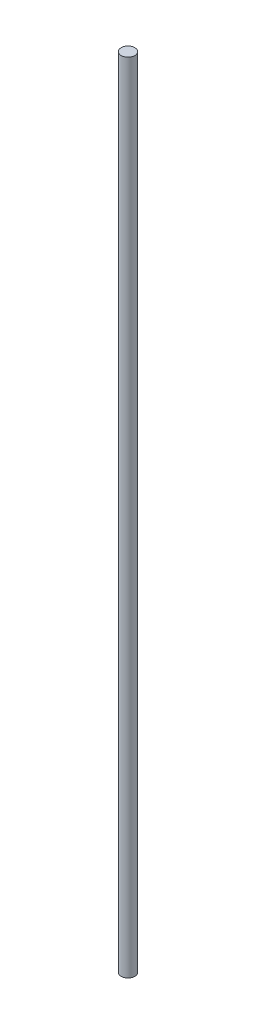
ISO-10303-21;
HEADER;
FILE_DESCRIPTION(('STEP AP214'),'2;1');
FILE_NAME('part.step','',(''),(''),'','','');
FILE_SCHEMA(('AUTOMOTIVE_DESIGN { 1 0 10303 214 1 1 1 1 }'));
ENDSEC;
DATA;
#1=APPLICATION_CONTEXT('core data for automotive mechanical design processes');
#2=APPLICATION_PROTOCOL_DEFINITION('international standard','automotive_design',2000,#1);
#3=PRODUCT_CONTEXT('',#1,'mechanical');
#4=PRODUCT('Part','Part','',(#3));
#5=PRODUCT_RELATED_PRODUCT_CATEGORY('part','',(#4));
#6=PRODUCT_DEFINITION_FORMATION('','',#4);
#7=PRODUCT_DEFINITION_CONTEXT('part definition',#1,'design');
#8=PRODUCT_DEFINITION('design','',#6,#7);
#9=PRODUCT_DEFINITION_SHAPE('','',#8);
#10=(LENGTH_UNIT() NAMED_UNIT(*) SI_UNIT(.MILLI.,.METRE.));
#11=(NAMED_UNIT(*) PLANE_ANGLE_UNIT() SI_UNIT($,.RADIAN.));
#12=(NAMED_UNIT(*) SI_UNIT($,.STERADIAN.) SOLID_ANGLE_UNIT());
#13=UNCERTAINTY_MEASURE_WITH_UNIT(LENGTH_MEASURE(1.E-05),#10,'distance_accuracy_value','');
#14=(GEOMETRIC_REPRESENTATION_CONTEXT(3) GLOBAL_UNCERTAINTY_ASSIGNED_CONTEXT((#13)) GLOBAL_UNIT_ASSIGNED_CONTEXT((#10,
#11,#12)) REPRESENTATION_CONTEXT('',''));
#15=CARTESIAN_POINT('',(0.,0.,0.));
#16=DIRECTION('',(0.,0.,1.));
#17=DIRECTION('',(1.,0.,0.));
#18=AXIS2_PLACEMENT_3D('',#15,#16,#17);
#19=CARTESIAN_POINT('',(0.,700.,0.));
#20=DIRECTION('',(0.,-1.,0.));
#21=DIRECTION('',(0.,0.,-1.));
#22=AXIS2_PLACEMENT_3D('',#19,#20,#21);
#23=CYLINDRICAL_SURFACE('',#22,6.);
#24=CARTESIAN_POINT('',(0.,700.,0.));
#25=DIRECTION('',(0.,1.,0.));
#26=DIRECTION('',(0.,0.,1.));
#27=AXIS2_PLACEMENT_3D('',#24,#25,#26);
#28=CIRCLE('',#27,6.);
#29=CARTESIAN_POINT('',(0.,700.,6.));
#30=VERTEX_POINT('',#29);
#31=EDGE_CURVE('E10',#30,#30,#28,.T.);
#32=ORIENTED_EDGE('',*,*,#31,.F.);
#33=EDGE_LOOP('',(#32));
#34=FACE_BOUND('',#33,.T.);
#35=CARTESIAN_POINT('',(0.,0.,0.));
#36=DIRECTION('',(0.,1.,0.));
#37=DIRECTION('',(0.,0.,1.));
#38=AXIS2_PLACEMENT_3D('',#35,#36,#37);
#39=CIRCLE('',#38,6.);
#40=CARTESIAN_POINT('',(0.,0.,6.));
#41=VERTEX_POINT('',#40);
#42=EDGE_CURVE('E37',#41,#41,#39,.T.);
#43=ORIENTED_EDGE('',*,*,#42,.T.);
#44=EDGE_LOOP('',(#43));
#45=FACE_BOUND('',#44,.T.);
#46=ADVANCED_FACE('F40',(#34,#45),#23,.T.);
#47=CARTESIAN_POINT('',(0.,700.,0.));
#48=DIRECTION('',(0.,1.,0.));
#49=DIRECTION('',(0.,0.,1.));
#50=AXIS2_PLACEMENT_3D('',#47,#48,#49);
#51=PLANE('',#50);
#52=ORIENTED_EDGE('',*,*,#31,.T.);
#53=EDGE_LOOP('',(#52));
#54=FACE_BOUND('',#53,.T.);
#55=ADVANCED_FACE('F55',(#54),#51,.T.);
#56=CARTESIAN_POINT('',(0.,0.,0.));
#57=DIRECTION('',(0.,1.,0.));
#58=DIRECTION('',(0.,0.,1.));
#59=AXIS2_PLACEMENT_3D('',#56,#57,#58);
#60=PLANE('',#59);
#61=ORIENTED_EDGE('',*,*,#42,.F.);
#62=EDGE_LOOP('',(#61));
#63=FACE_BOUND('',#62,.T.);
#64=ADVANCED_FACE('F49',(#63),#60,.F.);
#65=CLOSED_SHELL('',(#46,#55,#64));
#66=MANIFOLD_SOLID_BREP('B2',#65);
#67=ADVANCED_BREP_SHAPE_REPRESENTATION('',(#18,#66),#14);
#68=SHAPE_DEFINITION_REPRESENTATION(#9,#67);
ENDSEC;
END-ISO-10303-21;
